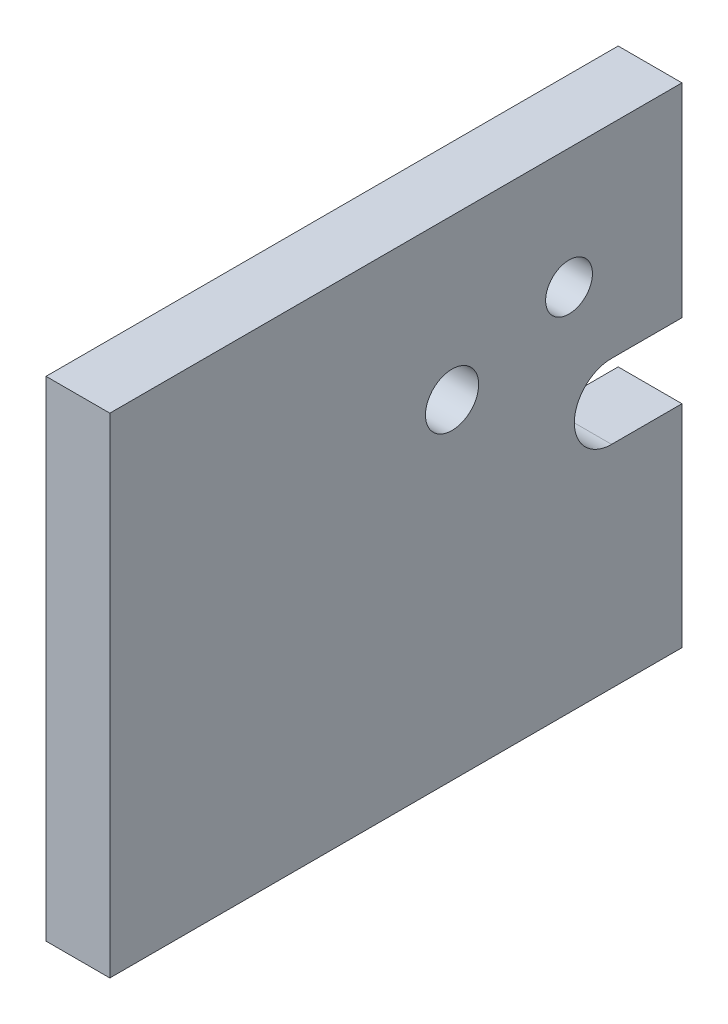
ISO-10303-21;
HEADER;
FILE_DESCRIPTION(('STEP AP214'),'2;1');
FILE_NAME('part.step','',(''),(''),'','','');
FILE_SCHEMA(('AUTOMOTIVE_DESIGN { 1 0 10303 214 1 1 1 1 }'));
ENDSEC;
DATA;
#1=APPLICATION_CONTEXT('core data for automotive mechanical design processes');
#2=APPLICATION_PROTOCOL_DEFINITION('international standard','automotive_design',2000,#1);
#3=PRODUCT_CONTEXT('',#1,'mechanical');
#4=PRODUCT('Part','Part','',(#3));
#5=PRODUCT_RELATED_PRODUCT_CATEGORY('part','',(#4));
#6=PRODUCT_DEFINITION_FORMATION('','',#4);
#7=PRODUCT_DEFINITION_CONTEXT('part definition',#1,'design');
#8=PRODUCT_DEFINITION('design','',#6,#7);
#9=PRODUCT_DEFINITION_SHAPE('','',#8);
#10=(LENGTH_UNIT() NAMED_UNIT(*) SI_UNIT(.MILLI.,.METRE.));
#11=(NAMED_UNIT(*) PLANE_ANGLE_UNIT() SI_UNIT($,.RADIAN.));
#12=(NAMED_UNIT(*) SI_UNIT($,.STERADIAN.) SOLID_ANGLE_UNIT());
#13=UNCERTAINTY_MEASURE_WITH_UNIT(LENGTH_MEASURE(1.E-05),#10,'distance_accuracy_value','');
#14=(GEOMETRIC_REPRESENTATION_CONTEXT(3) GLOBAL_UNCERTAINTY_ASSIGNED_CONTEXT((#13)) GLOBAL_UNIT_ASSIGNED_CONTEXT((#10,
#11,#12)) REPRESENTATION_CONTEXT('',''));
#15=CARTESIAN_POINT('',(0.,0.,0.));
#16=DIRECTION('',(0.,0.,1.));
#17=DIRECTION('',(1.,0.,0.));
#18=AXIS2_PLACEMENT_3D('',#15,#16,#17);
#19=CARTESIAN_POINT('',(3.,-2.5,-2.5));
#20=DIRECTION('',(-1.,0.,0.));
#21=DIRECTION('',(0.,0.,1.));
#22=AXIS2_PLACEMENT_3D('',#19,#20,#21);
#23=CYLINDRICAL_SURFACE('',#22,1.1);
#24=CARTESIAN_POINT('',(3.,-2.5,-2.5));
#25=DIRECTION('',(1.,0.,0.));
#26=DIRECTION('',(0.,0.,-1.));
#27=AXIS2_PLACEMENT_3D('',#24,#25,#26);
#28=CIRCLE('',#27,1.1);
#29=CARTESIAN_POINT('',(3.,-2.5,-3.6));
#30=VERTEX_POINT('',#29);
#31=EDGE_CURVE('E11',#30,#30,#28,.T.);
#32=ORIENTED_EDGE('',*,*,#31,.T.);
#33=EDGE_LOOP('',(#32));
#34=FACE_BOUND('',#33,.T.);
#35=CARTESIAN_POINT('',(0.,-2.5,-2.5));
#36=DIRECTION('',(1.,0.,0.));
#37=DIRECTION('',(0.,0.,-1.));
#38=AXIS2_PLACEMENT_3D('',#35,#36,#37);
#39=CIRCLE('',#38,1.1);
#40=CARTESIAN_POINT('',(0.,-2.5,-3.6));
#41=VERTEX_POINT('',#40);
#42=EDGE_CURVE('E44',#41,#41,#39,.T.);
#43=ORIENTED_EDGE('',*,*,#42,.F.);
#44=EDGE_LOOP('',(#43));
#45=FACE_BOUND('',#44,.T.);
#46=ADVANCED_FACE('F41',(#34,#45),#23,.F.);
#47=CARTESIAN_POINT('',(3.,0.,0.));
#48=DIRECTION('',(1.,0.,0.));
#49=DIRECTION('',(0.,0.,-1.));
#50=AXIS2_PLACEMENT_3D('',#47,#48,#49);
#51=PLANE('',#50);
#52=ORIENTED_EDGE('',*,*,#31,.F.);
#53=EDGE_LOOP('',(#52));
#54=FACE_BOUND('',#53,.T.);
#55=DIRECTION('',(0.,0.,1.));
#56=VECTOR('',#55,1.);
#57=CARTESIAN_POINT('',(3.,-19.8411952639523,0.));
#58=LINE('',#57,#56);
#59=CARTESIAN_POINT('',(3.,-19.8411952639523,-7.80983005625052));
#60=VERTEX_POINT('',#59);
#61=CARTESIAN_POINT('',(3.,-19.8411952639523,19.0901699437495));
#62=VERTEX_POINT('',#61);
#63=EDGE_CURVE('E156',#60,#62,#58,.T.);
#64=ORIENTED_EDGE('',*,*,#63,.F.);
#65=DIRECTION('',(0.,-1.,0.));
#66=VECTOR('',#65,1.);
#67=CARTESIAN_POINT('',(3.,0.,-7.80983005625052));
#68=LINE('',#67,#66);
#69=CARTESIAN_POINT('',(3.,-9.90685424949231,-7.80983005625052));
#70=VERTEX_POINT('',#69);
#71=EDGE_CURVE('E78',#70,#60,#68,.T.);
#72=ORIENTED_EDGE('',*,*,#71,.F.);
#73=DIRECTION('',(0.,0.,1.));
#74=VECTOR('',#73,1.);
#75=CARTESIAN_POINT('',(3.,-9.90685424949231,0.));
#76=LINE('',#75,#74);
#77=CARTESIAN_POINT('',(3.,-9.90685424949231,-4.50000000000106));
#78=VERTEX_POINT('',#77);
#79=EDGE_CURVE('E150',#70,#78,#76,.T.);
#80=ORIENTED_EDGE('',*,*,#79,.T.);
#81=CARTESIAN_POINT('',(3.,-8.15685424949231,-4.50000000000106));
#82=DIRECTION('',(1.,0.,0.));
#83=DIRECTION('',(0.,0.,-1.));
#84=AXIS2_PLACEMENT_3D('',#81,#82,#83);
#85=CIRCLE('',#84,1.75);
#86=CARTESIAN_POINT('',(3.,-6.40685424949231,-4.50000000000106));
#87=VERTEX_POINT('',#86);
#88=EDGE_CURVE('E147',#78,#87,#85,.F.);
#89=ORIENTED_EDGE('',*,*,#88,.T.);
#90=DIRECTION('',(0.,0.,-1.));
#91=VECTOR('',#90,1.);
#92=CARTESIAN_POINT('',(3.,-6.40685424949231,0.));
#93=LINE('',#92,#91);
#94=CARTESIAN_POINT('',(3.,-6.40685424949231,-7.80983005625052));
#95=VERTEX_POINT('',#94);
#96=EDGE_CURVE('E145',#87,#95,#93,.T.);
#97=ORIENTED_EDGE('',*,*,#96,.T.);
#98=DIRECTION('',(0.,1.,0.));
#99=VECTOR('',#98,1.);
#100=CARTESIAN_POINT('',(3.,0.,-7.80983005625052));
#101=LINE('',#100,#99);
#102=CARTESIAN_POINT('',(3.,3.1588047360477,-7.80983005625052));
#103=VERTEX_POINT('',#102);
#104=EDGE_CURVE('E130',#95,#103,#101,.T.);
#105=ORIENTED_EDGE('',*,*,#104,.T.);
#106=DIRECTION('',(0.,0.,-1.));
#107=VECTOR('',#106,1.);
#108=CARTESIAN_POINT('',(3.,3.1588047360477,0.));
#109=LINE('',#108,#107);
#110=CARTESIAN_POINT('',(3.,3.1588047360477,19.0901699437495));
#111=VERTEX_POINT('',#110);
#112=EDGE_CURVE('E117',#111,#103,#109,.T.);
#113=ORIENTED_EDGE('',*,*,#112,.F.);
#114=DIRECTION('',(0.,-1.,0.));
#115=VECTOR('',#114,1.);
#116=CARTESIAN_POINT('',(3.,0.,19.0901699437495));
#117=LINE('',#116,#115);
#118=EDGE_CURVE('E125',#111,#62,#117,.T.);
#119=ORIENTED_EDGE('',*,*,#118,.T.);
#120=EDGE_LOOP('',(#64,#72,#80,#89,#97,#105,#113,#119));
#121=FACE_BOUND('',#120,.T.);
#122=CARTESIAN_POINT('',(3.,-4.34119526395224,3.));
#123=DIRECTION('',(1.,0.,0.));
#124=DIRECTION('',(0.,0.,-1.));
#125=AXIS2_PLACEMENT_3D('',#122,#123,#124);
#126=CIRCLE('',#125,1.25);
#127=CARTESIAN_POINT('',(3.,-4.34119526395224,1.75));
#128=VERTEX_POINT('',#127);
#129=EDGE_CURVE('E129',#128,#128,#126,.F.);
#130=ORIENTED_EDGE('',*,*,#129,.T.);
#131=EDGE_LOOP('',(#130));
#132=FACE_BOUND('',#131,.T.);
#133=ADVANCED_FACE('F133',(#54,#121,#132),#51,.T.);
#134=CARTESIAN_POINT('',(0.,0.,0.));
#135=DIRECTION('',(1.,0.,0.));
#136=DIRECTION('',(0.,0.,-1.));
#137=AXIS2_PLACEMENT_3D('',#134,#135,#136);
#138=PLANE('',#137);
#139=ORIENTED_EDGE('',*,*,#42,.T.);
#140=EDGE_LOOP('',(#139));
#141=FACE_BOUND('',#140,.T.);
#142=DIRECTION('',(0.,0.,1.));
#143=VECTOR('',#142,1.);
#144=CARTESIAN_POINT('',(0.,-19.8411952639523,0.));
#145=LINE('',#144,#143);
#146=CARTESIAN_POINT('',(0.,-19.8411952639523,-7.80983005625052));
#147=VERTEX_POINT('',#146);
#148=CARTESIAN_POINT('',(0.,-19.8411952639523,19.0901699437495));
#149=VERTEX_POINT('',#148);
#150=EDGE_CURVE('E177',#147,#149,#145,.T.);
#151=ORIENTED_EDGE('',*,*,#150,.T.);
#152=DIRECTION('',(0.,-1.,0.));
#153=VECTOR('',#152,1.);
#154=CARTESIAN_POINT('',(0.,0.,19.0901699437495));
#155=LINE('',#154,#153);
#156=CARTESIAN_POINT('',(0.,3.1588047360477,19.0901699437495));
#157=VERTEX_POINT('',#156);
#158=EDGE_CURVE('E121',#157,#149,#155,.T.);
#159=ORIENTED_EDGE('',*,*,#158,.F.);
#160=DIRECTION('',(0.,0.,-1.));
#161=VECTOR('',#160,1.);
#162=CARTESIAN_POINT('',(0.,3.1588047360477,0.));
#163=LINE('',#162,#161);
#164=CARTESIAN_POINT('',(0.,3.1588047360477,-7.80983005625052));
#165=VERTEX_POINT('',#164);
#166=EDGE_CURVE('E120',#157,#165,#163,.T.);
#167=ORIENTED_EDGE('',*,*,#166,.T.);
#168=DIRECTION('',(0.,1.,0.));
#169=VECTOR('',#168,1.);
#170=CARTESIAN_POINT('',(0.,0.,-7.80983005625052));
#171=LINE('',#170,#169);
#172=CARTESIAN_POINT('',(0.,-6.40685424949231,-7.80983005625052));
#173=VERTEX_POINT('',#172);
#174=EDGE_CURVE('E137',#173,#165,#171,.T.);
#175=ORIENTED_EDGE('',*,*,#174,.F.);
#176=DIRECTION('',(0.,0.,-1.));
#177=VECTOR('',#176,1.);
#178=CARTESIAN_POINT('',(0.,-6.40685424949231,0.));
#179=LINE('',#178,#177);
#180=CARTESIAN_POINT('',(0.,-6.40685424949231,-4.50000000000106));
#181=VERTEX_POINT('',#180);
#182=EDGE_CURVE('E167',#181,#173,#179,.T.);
#183=ORIENTED_EDGE('',*,*,#182,.F.);
#184=CARTESIAN_POINT('',(0.,-8.15685424949231,-4.50000000000106));
#185=DIRECTION('',(-1.,0.,0.));
#186=DIRECTION('',(0.,0.,1.));
#187=AXIS2_PLACEMENT_3D('',#184,#185,#186);
#188=CIRCLE('',#187,1.75);
#189=CARTESIAN_POINT('',(0.,-9.90685424949231,-4.50000000000106));
#190=VERTEX_POINT('',#189);
#191=EDGE_CURVE('E164',#190,#181,#188,.T.);
#192=ORIENTED_EDGE('',*,*,#191,.F.);
#193=DIRECTION('',(0.,0.,1.));
#194=VECTOR('',#193,1.);
#195=CARTESIAN_POINT('',(0.,-9.90685424949231,0.));
#196=LINE('',#195,#194);
#197=CARTESIAN_POINT('',(0.,-9.90685424949231,-7.80983005625052));
#198=VERTEX_POINT('',#197);
#199=EDGE_CURVE('E161',#198,#190,#196,.T.);
#200=ORIENTED_EDGE('',*,*,#199,.F.);
#201=DIRECTION('',(0.,-1.,0.));
#202=VECTOR('',#201,1.);
#203=CARTESIAN_POINT('',(0.,0.,-7.80983005625052));
#204=LINE('',#203,#202);
#205=EDGE_CURVE('E153',#198,#147,#204,.T.);
#206=ORIENTED_EDGE('',*,*,#205,.T.);
#207=EDGE_LOOP('',(#151,#159,#167,#175,#183,#192,#200,#206));
#208=FACE_BOUND('',#207,.T.);
#209=CARTESIAN_POINT('',(0.,-4.34119526395224,3.));
#210=DIRECTION('',(-1.,0.,0.));
#211=DIRECTION('',(0.,0.,1.));
#212=AXIS2_PLACEMENT_3D('',#209,#210,#211);
#213=CIRCLE('',#212,1.25);
#214=CARTESIAN_POINT('',(0.,-4.34119526395224,4.25));
#215=VERTEX_POINT('',#214);
#216=EDGE_CURVE('E122',#215,#215,#213,.T.);
#217=ORIENTED_EDGE('',*,*,#216,.F.);
#218=EDGE_LOOP('',(#217));
#219=FACE_BOUND('',#218,.T.);
#220=ADVANCED_FACE('F181',(#141,#208,#219),#138,.F.);
#221=CARTESIAN_POINT('',(38.392230785866,-19.8411952639523,0.));
#222=DIRECTION('',(0.,-1.,0.));
#223=DIRECTION('',(0.,0.,-1.));
#224=AXIS2_PLACEMENT_3D('',#221,#222,#223);
#225=PLANE('',#224);
#226=DIRECTION('',(-1.,0.,0.));
#227=VECTOR('',#226,1.);
#228=CARTESIAN_POINT('',(38.392230785866,-19.8411952639523,-7.80983005625052));
#229=LINE('',#228,#227);
#230=EDGE_CURVE('E155',#60,#147,#229,.T.);
#231=ORIENTED_EDGE('',*,*,#230,.F.);
#232=ORIENTED_EDGE('',*,*,#63,.T.);
#233=DIRECTION('',(-1.,0.,0.));
#234=VECTOR('',#233,1.);
#235=CARTESIAN_POINT('',(38.392230785866,-19.8411952639523,19.0901699437495));
#236=LINE('',#235,#234);
#237=EDGE_CURVE('E55',#62,#149,#236,.T.);
#238=ORIENTED_EDGE('',*,*,#237,.T.);
#239=ORIENTED_EDGE('',*,*,#150,.F.);
#240=EDGE_LOOP('',(#231,#232,#238,#239));
#241=FACE_BOUND('',#240,.T.);
#242=ADVANCED_FACE('F185',(#241),#225,.T.);
#243=CARTESIAN_POINT('',(38.392230785866,0.,-7.80983005625052));
#244=DIRECTION('',(0.,0.,-1.));
#245=DIRECTION('',(0.,1.,0.));
#246=AXIS2_PLACEMENT_3D('',#243,#244,#245);
#247=PLANE('',#246);
#248=DIRECTION('',(-1.,0.,0.));
#249=VECTOR('',#248,1.);
#250=CARTESIAN_POINT('',(38.392230785866,-9.90685424949231,-7.80983005625052));
#251=LINE('',#250,#249);
#252=EDGE_CURVE('E159',#70,#198,#251,.T.);
#253=ORIENTED_EDGE('',*,*,#252,.F.);
#254=ORIENTED_EDGE('',*,*,#71,.T.);
#255=ORIENTED_EDGE('',*,*,#230,.T.);
#256=ORIENTED_EDGE('',*,*,#205,.F.);
#257=EDGE_LOOP('',(#253,#254,#255,#256));
#258=FACE_BOUND('',#257,.T.);
#259=ADVANCED_FACE('F190',(#258),#247,.T.);
#260=CARTESIAN_POINT('',(38.392230785866,-9.90685424949231,0.));
#261=DIRECTION('',(0.,-1.,0.));
#262=DIRECTION('',(0.,0.,-1.));
#263=AXIS2_PLACEMENT_3D('',#260,#261,#262);
#264=PLANE('',#263);
#265=ORIENTED_EDGE('',*,*,#79,.F.);
#266=ORIENTED_EDGE('',*,*,#252,.T.);
#267=ORIENTED_EDGE('',*,*,#199,.T.);
#268=DIRECTION('',(-1.,0.,0.));
#269=VECTOR('',#268,1.);
#270=CARTESIAN_POINT('',(38.392230785866,-9.90685424949231,-4.50000000000106));
#271=LINE('',#270,#269);
#272=EDGE_CURVE('E162',#78,#190,#271,.T.);
#273=ORIENTED_EDGE('',*,*,#272,.F.);
#274=EDGE_LOOP('',(#265,#266,#267,#273));
#275=FACE_BOUND('',#274,.T.);
#276=ADVANCED_FACE('F188',(#275),#264,.F.);
#277=CARTESIAN_POINT('',(38.392230785866,-8.15685424949231,-4.50000000000106));
#278=DIRECTION('',(-1.,0.,0.));
#279=DIRECTION('',(0.,0.,1.));
#280=AXIS2_PLACEMENT_3D('',#277,#278,#279);
#281=CYLINDRICAL_SURFACE('',#280,1.75);
#282=ORIENTED_EDGE('',*,*,#88,.F.);
#283=ORIENTED_EDGE('',*,*,#272,.T.);
#284=ORIENTED_EDGE('',*,*,#191,.T.);
#285=DIRECTION('',(-1.,0.,0.));
#286=VECTOR('',#285,1.);
#287=CARTESIAN_POINT('',(38.392230785866,-6.40685424949231,-4.50000000000106));
#288=LINE('',#287,#286);
#289=EDGE_CURVE('E165',#87,#181,#288,.T.);
#290=ORIENTED_EDGE('',*,*,#289,.F.);
#291=EDGE_LOOP('',(#282,#283,#284,#290));
#292=FACE_BOUND('',#291,.T.);
#293=ADVANCED_FACE('F197',(#292),#281,.F.);
#294=CARTESIAN_POINT('',(38.392230785866,-6.40685424949231,0.));
#295=DIRECTION('',(0.,1.,0.));
#296=DIRECTION('',(0.,0.,1.));
#297=AXIS2_PLACEMENT_3D('',#294,#295,#296);
#298=PLANE('',#297);
#299=ORIENTED_EDGE('',*,*,#96,.F.);
#300=ORIENTED_EDGE('',*,*,#289,.T.);
#301=ORIENTED_EDGE('',*,*,#182,.T.);
#302=DIRECTION('',(-1.,0.,0.));
#303=VECTOR('',#302,1.);
#304=CARTESIAN_POINT('',(38.392230785866,-6.40685424949231,-7.80983005625052));
#305=LINE('',#304,#303);
#306=EDGE_CURVE('E111',#95,#173,#305,.T.);
#307=ORIENTED_EDGE('',*,*,#306,.F.);
#308=EDGE_LOOP('',(#299,#300,#301,#307));
#309=FACE_BOUND('',#308,.T.);
#310=ADVANCED_FACE('F198',(#309),#298,.F.);
#311=CARTESIAN_POINT('',(38.392230785866,0.,-7.80983005625052));
#312=DIRECTION('',(0.,0.,1.));
#313=DIRECTION('',(1.,0.,0.));
#314=AXIS2_PLACEMENT_3D('',#311,#312,#313);
#315=PLANE('',#314);
#316=ORIENTED_EDGE('',*,*,#104,.F.);
#317=ORIENTED_EDGE('',*,*,#306,.T.);
#318=ORIENTED_EDGE('',*,*,#174,.T.);
#319=DIRECTION('',(-1.,0.,0.));
#320=VECTOR('',#319,1.);
#321=CARTESIAN_POINT('',(38.392230785866,3.1588047360477,-7.80983005625052));
#322=LINE('',#321,#320);
#323=EDGE_CURVE('E136',#103,#165,#322,.T.);
#324=ORIENTED_EDGE('',*,*,#323,.F.);
#325=EDGE_LOOP('',(#316,#317,#318,#324));
#326=FACE_BOUND('',#325,.T.);
#327=ADVANCED_FACE('F200',(#326),#315,.F.);
#328=CARTESIAN_POINT('',(38.392230785866,3.1588047360477,0.));
#329=DIRECTION('',(0.,1.,0.));
#330=DIRECTION('',(0.,0.,1.));
#331=AXIS2_PLACEMENT_3D('',#328,#329,#330);
#332=PLANE('',#331);
#333=DIRECTION('',(-1.,0.,0.));
#334=VECTOR('',#333,1.);
#335=CARTESIAN_POINT('',(38.392230785866,3.1588047360477,19.0901699437495));
#336=LINE('',#335,#334);
#337=EDGE_CURVE('E61',#111,#157,#336,.T.);
#338=ORIENTED_EDGE('',*,*,#337,.F.);
#339=ORIENTED_EDGE('',*,*,#112,.T.);
#340=ORIENTED_EDGE('',*,*,#323,.T.);
#341=ORIENTED_EDGE('',*,*,#166,.F.);
#342=EDGE_LOOP('',(#338,#339,#340,#341));
#343=FACE_BOUND('',#342,.T.);
#344=ADVANCED_FACE('F115',(#343),#332,.T.);
#345=CARTESIAN_POINT('',(38.392230785866,-4.34119526395224,3.));
#346=DIRECTION('',(-1.,0.,0.));
#347=DIRECTION('',(0.,0.,1.));
#348=AXIS2_PLACEMENT_3D('',#345,#346,#347);
#349=CYLINDRICAL_SURFACE('',#348,1.25);
#350=ORIENTED_EDGE('',*,*,#216,.T.);
#351=EDGE_LOOP('',(#350));
#352=FACE_BOUND('',#351,.T.);
#353=ORIENTED_EDGE('',*,*,#129,.F.);
#354=EDGE_LOOP('',(#353));
#355=FACE_BOUND('',#354,.T.);
#356=ADVANCED_FACE('F223',(#352,#355),#349,.F.);
#357=CARTESIAN_POINT('',(38.392230785866,0.,19.0901699437495));
#358=DIRECTION('',(0.,0.,-1.));
#359=DIRECTION('',(-1.,0.,0.));
#360=AXIS2_PLACEMENT_3D('',#357,#358,#359);
#361=PLANE('',#360);
#362=ORIENTED_EDGE('',*,*,#118,.F.);
#363=ORIENTED_EDGE('',*,*,#337,.T.);
#364=ORIENTED_EDGE('',*,*,#158,.T.);
#365=ORIENTED_EDGE('',*,*,#237,.F.);
#366=EDGE_LOOP('',(#362,#363,#364,#365));
#367=FACE_BOUND('',#366,.T.);
#368=ADVANCED_FACE('F126',(#367),#361,.F.);
#369=CLOSED_SHELL('',(#46,#133,#220,#242,#259,#276,#293,#310,#327,#344,#356,#368));
#370=MANIFOLD_SOLID_BREP('B2',#369);
#371=ADVANCED_BREP_SHAPE_REPRESENTATION('',(#18,#370),#14);
#372=SHAPE_DEFINITION_REPRESENTATION(#9,#371);
ENDSEC;
END-ISO-10303-21;
